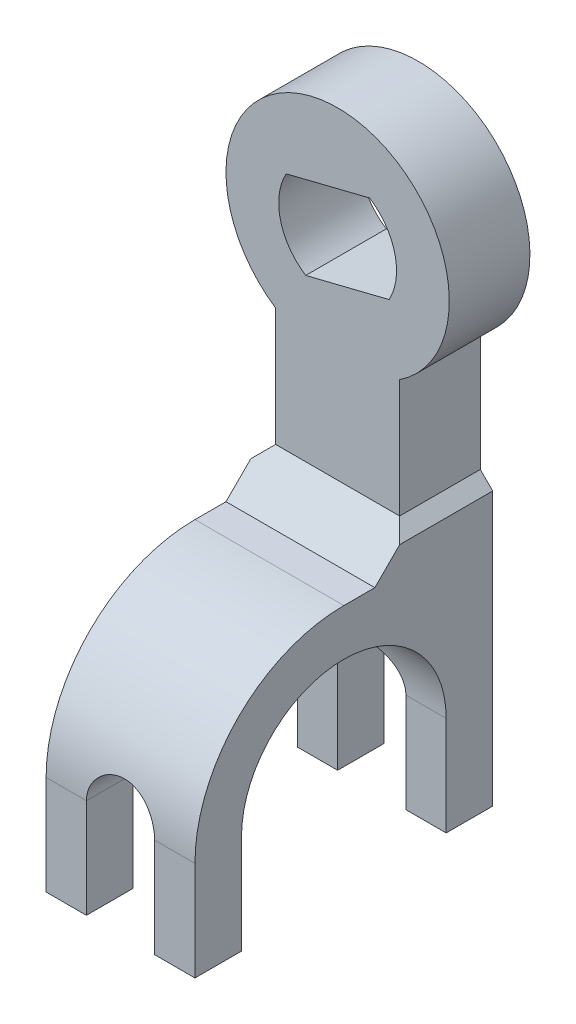
ISO-10303-21;
HEADER;
FILE_DESCRIPTION(('STEP AP214'),'2;1');
FILE_NAME('part.step','',(''),(''),'','','');
FILE_SCHEMA(('AUTOMOTIVE_DESIGN { 1 0 10303 214 1 1 1 1 }'));
ENDSEC;
DATA;
#1=APPLICATION_CONTEXT('core data for automotive mechanical design processes');
#2=APPLICATION_PROTOCOL_DEFINITION('international standard','automotive_design',2000,#1);
#3=PRODUCT_CONTEXT('',#1,'mechanical');
#4=PRODUCT('Part','Part','',(#3));
#5=PRODUCT_RELATED_PRODUCT_CATEGORY('part','',(#4));
#6=PRODUCT_DEFINITION_FORMATION('','',#4);
#7=PRODUCT_DEFINITION_CONTEXT('part definition',#1,'design');
#8=PRODUCT_DEFINITION('design','',#6,#7);
#9=PRODUCT_DEFINITION_SHAPE('','',#8);
#10=(LENGTH_UNIT() NAMED_UNIT(*) SI_UNIT(.MILLI.,.METRE.));
#11=(NAMED_UNIT(*) PLANE_ANGLE_UNIT() SI_UNIT($,.RADIAN.));
#12=(NAMED_UNIT(*) SI_UNIT($,.STERADIAN.) SOLID_ANGLE_UNIT());
#13=UNCERTAINTY_MEASURE_WITH_UNIT(LENGTH_MEASURE(1.E-05),#10,'distance_accuracy_value','');
#14=(GEOMETRIC_REPRESENTATION_CONTEXT(3) GLOBAL_UNCERTAINTY_ASSIGNED_CONTEXT((#13)) GLOBAL_UNIT_ASSIGNED_CONTEXT((#10,
#11,#12)) REPRESENTATION_CONTEXT('',''));
#15=CARTESIAN_POINT('',(0.,0.,0.));
#16=DIRECTION('',(0.,0.,1.));
#17=DIRECTION('',(1.,0.,0.));
#18=AXIS2_PLACEMENT_3D('',#15,#16,#17);
#19=CARTESIAN_POINT('',(6.,-40.,24.));
#20=DIRECTION('',(0.,0.,-1.));
#21=DIRECTION('',(-1.,0.,0.));
#22=AXIS2_PLACEMENT_3D('',#19,#20,#21);
#23=PLANE('',#22);
#24=DIRECTION('',(-1.,0.,0.));
#25=VECTOR('',#24,1.);
#26=CARTESIAN_POINT('',(6.,-32.,24.));
#27=LINE('',#26,#25);
#28=CARTESIAN_POINT('',(6.,-32.,24.));
#29=VERTEX_POINT('',#28);
#30=CARTESIAN_POINT('',(2.75,-32.,24.));
#31=VERTEX_POINT('',#30);
#32=EDGE_CURVE('E432',#29,#31,#27,.T.);
#33=ORIENTED_EDGE('',*,*,#32,.T.);
#34=DIRECTION('',(0.,1.,0.));
#35=VECTOR('',#34,1.);
#36=CARTESIAN_POINT('',(2.75,-32.,24.));
#37=LINE('',#36,#35);
#38=CARTESIAN_POINT('',(2.75,-40.,24.));
#39=VERTEX_POINT('',#38);
#40=EDGE_CURVE('E251',#39,#31,#37,.T.);
#41=ORIENTED_EDGE('',*,*,#40,.F.);
#42=DIRECTION('',(-1.,0.,0.));
#43=VECTOR('',#42,1.);
#44=CARTESIAN_POINT('',(6.,-40.,24.));
#45=LINE('',#44,#43);
#46=CARTESIAN_POINT('',(6.,-40.,24.));
#47=VERTEX_POINT('',#46);
#48=EDGE_CURVE('E420',#47,#39,#45,.T.);
#49=ORIENTED_EDGE('',*,*,#48,.F.);
#50=DIRECTION('',(0.,-1.,0.));
#51=VECTOR('',#50,1.);
#52=CARTESIAN_POINT('',(6.,-40.,24.));
#53=LINE('',#52,#51);
#54=EDGE_CURVE('E679',#29,#47,#53,.T.);
#55=ORIENTED_EDGE('',*,*,#54,.F.);
#56=EDGE_LOOP('',(#33,#41,#49,#55));
#57=FACE_BOUND('',#56,.T.);
#58=ADVANCED_FACE('F41',(#57),#23,.F.);
#59=CARTESIAN_POINT('',(6.,-40.,20.25));
#60=DIRECTION('',(0.,1.,0.));
#61=DIRECTION('',(0.,0.,1.));
#62=AXIS2_PLACEMENT_3D('',#59,#60,#61);
#63=PLANE('',#62);
#64=ORIENTED_EDGE('',*,*,#48,.T.);
#65=DIRECTION('',(0.,0.,1.));
#66=VECTOR('',#65,1.);
#67=CARTESIAN_POINT('',(2.75,-40.,0.));
#68=LINE('',#67,#66);
#69=CARTESIAN_POINT('',(2.75,-40.,20.25));
#70=VERTEX_POINT('',#69);
#71=EDGE_CURVE('E270',#70,#39,#68,.T.);
#72=ORIENTED_EDGE('',*,*,#71,.F.);
#73=DIRECTION('',(-1.,0.,0.));
#74=VECTOR('',#73,1.);
#75=CARTESIAN_POINT('',(6.,-40.,20.25));
#76=LINE('',#75,#74);
#77=CARTESIAN_POINT('',(6.,-40.,20.25));
#78=VERTEX_POINT('',#77);
#79=EDGE_CURVE('E421',#78,#70,#76,.T.);
#80=ORIENTED_EDGE('',*,*,#79,.F.);
#81=DIRECTION('',(0.,0.,-1.));
#82=VECTOR('',#81,1.);
#83=CARTESIAN_POINT('',(6.,-40.,20.25));
#84=LINE('',#83,#82);
#85=EDGE_CURVE('E682',#47,#78,#84,.T.);
#86=ORIENTED_EDGE('',*,*,#85,.F.);
#87=EDGE_LOOP('',(#64,#72,#80,#86));
#88=FACE_BOUND('',#87,.T.);
#89=ADVANCED_FACE('F393',(#88),#63,.F.);
#90=CARTESIAN_POINT('',(6.,-32.,20.25));
#91=DIRECTION('',(0.,0.,1.));
#92=DIRECTION('',(1.,0.,0.));
#93=AXIS2_PLACEMENT_3D('',#90,#91,#92);
#94=PLANE('',#93);
#95=ORIENTED_EDGE('',*,*,#79,.T.);
#96=DIRECTION('',(0.,1.,0.));
#97=VECTOR('',#96,1.);
#98=CARTESIAN_POINT('',(2.75,-32.,20.25));
#99=LINE('',#98,#97);
#100=CARTESIAN_POINT('',(2.75,-32.,20.25));
#101=VERTEX_POINT('',#100);
#102=EDGE_CURVE('E283',#70,#101,#99,.T.);
#103=ORIENTED_EDGE('',*,*,#102,.T.);
#104=DIRECTION('',(-1.,0.,0.));
#105=VECTOR('',#104,1.);
#106=CARTESIAN_POINT('',(6.,-32.,20.25));
#107=LINE('',#106,#105);
#108=CARTESIAN_POINT('',(6.,-32.,20.25));
#109=VERTEX_POINT('',#108);
#110=EDGE_CURVE('E621',#109,#101,#107,.T.);
#111=ORIENTED_EDGE('',*,*,#110,.F.);
#112=DIRECTION('',(0.,1.,0.));
#113=VECTOR('',#112,1.);
#114=CARTESIAN_POINT('',(6.,-32.,20.25));
#115=LINE('',#114,#113);
#116=EDGE_CURVE('E686',#78,#109,#115,.T.);
#117=ORIENTED_EDGE('',*,*,#116,.F.);
#118=EDGE_LOOP('',(#95,#103,#111,#117));
#119=FACE_BOUND('',#118,.T.);
#120=ADVANCED_FACE('F398',(#119),#94,.F.);
#121=CARTESIAN_POINT('',(6.,-32.,3.75));
#122=DIRECTION('',(0.,0.,-1.));
#123=DIRECTION('',(0.,1.,0.));
#124=AXIS2_PLACEMENT_3D('',#121,#122,#123);
#125=PLANE('',#124);
#126=DIRECTION('',(-1.,0.,0.));
#127=VECTOR('',#126,1.);
#128=CARTESIAN_POINT('',(6.,-32.,3.75));
#129=LINE('',#128,#127);
#130=CARTESIAN_POINT('',(6.,-32.,3.75));
#131=VERTEX_POINT('',#130);
#132=CARTESIAN_POINT('',(2.75,-32.,3.75));
#133=VERTEX_POINT('',#132);
#134=EDGE_CURVE('E617',#131,#133,#129,.T.);
#135=ORIENTED_EDGE('',*,*,#134,.T.);
#136=DIRECTION('',(0.,-1.,0.));
#137=VECTOR('',#136,1.);
#138=CARTESIAN_POINT('',(2.75,-32.,3.75));
#139=LINE('',#138,#137);
#140=CARTESIAN_POINT('',(2.75,-40.,3.75));
#141=VERTEX_POINT('',#140);
#142=EDGE_CURVE('E279',#133,#141,#139,.T.);
#143=ORIENTED_EDGE('',*,*,#142,.T.);
#144=DIRECTION('',(-1.,0.,0.));
#145=VECTOR('',#144,1.);
#146=CARTESIAN_POINT('',(6.,-40.,3.75));
#147=LINE('',#146,#145);
#148=CARTESIAN_POINT('',(6.,-40.,3.75));
#149=VERTEX_POINT('',#148);
#150=EDGE_CURVE('E612',#149,#141,#147,.T.);
#151=ORIENTED_EDGE('',*,*,#150,.F.);
#152=DIRECTION('',(0.,-1.,0.));
#153=VECTOR('',#152,1.);
#154=CARTESIAN_POINT('',(6.,-32.,3.75));
#155=LINE('',#154,#153);
#156=EDGE_CURVE('E663',#131,#149,#155,.T.);
#157=ORIENTED_EDGE('',*,*,#156,.F.);
#158=EDGE_LOOP('',(#135,#143,#151,#157));
#159=FACE_BOUND('',#158,.T.);
#160=ADVANCED_FACE('F650',(#159),#125,.F.);
#161=CARTESIAN_POINT('',(6.,-40.,0.));
#162=DIRECTION('',(0.,1.,0.));
#163=DIRECTION('',(0.,0.,1.));
#164=AXIS2_PLACEMENT_3D('',#161,#162,#163);
#165=PLANE('',#164);
#166=ORIENTED_EDGE('',*,*,#150,.T.);
#167=CARTESIAN_POINT('',(2.75,-40.,0.));
#168=VERTEX_POINT('',#167);
#169=EDGE_CURVE('E267',#168,#141,#68,.T.);
#170=ORIENTED_EDGE('',*,*,#169,.F.);
#171=DIRECTION('',(-1.,0.,0.));
#172=VECTOR('',#171,1.);
#173=CARTESIAN_POINT('',(6.,-40.,0.));
#174=LINE('',#173,#172);
#175=CARTESIAN_POINT('',(6.,-40.,0.));
#176=VERTEX_POINT('',#175);
#177=EDGE_CURVE('E608',#176,#168,#174,.T.);
#178=ORIENTED_EDGE('',*,*,#177,.F.);
#179=DIRECTION('',(0.,0.,-1.));
#180=VECTOR('',#179,1.);
#181=CARTESIAN_POINT('',(6.,-40.,0.));
#182=LINE('',#181,#180);
#183=EDGE_CURVE('E576',#149,#176,#182,.T.);
#184=ORIENTED_EDGE('',*,*,#183,.F.);
#185=EDGE_LOOP('',(#166,#170,#178,#184));
#186=FACE_BOUND('',#185,.T.);
#187=ADVANCED_FACE('F361',(#186),#165,.F.);
#188=CARTESIAN_POINT('',(0.,0.,6.5));
#189=DIRECTION('',(0.,0.,1.));
#190=DIRECTION('',(1.,0.,0.));
#191=AXIS2_PLACEMENT_3D('',#188,#189,#190);
#192=PLANE('',#191);
#193=DIRECTION('',(-0.970295726275996,-0.241921895599669,0.));
#194=VECTOR('',#193,1.);
#195=CARTESIAN_POINT('',(2.57495683185502,3.99150313968099,6.5));
#196=LINE('',#195,#194);
#197=CARTESIAN_POINT('',(2.57495683185502,3.99150313968099,6.5));
#198=VERTEX_POINT('',#197);
#199=CARTESIAN_POINT('',(-4.14744915325286,2.31541908111299,6.5));
#200=VERTEX_POINT('',#199);
#201=EDGE_CURVE('E439',#198,#200,#196,.T.);
#202=ORIENTED_EDGE('',*,*,#201,.F.);
#203=CARTESIAN_POINT('',(0.,0.,6.5));
#204=DIRECTION('',(0.,0.,1.));
#205=DIRECTION('',(1.,0.,0.));
#206=AXIS2_PLACEMENT_3D('',#203,#204,#205);
#207=CIRCLE('',#206,4.75);
#208=CARTESIAN_POINT('',(4.14744915325286,-2.31541908111299,6.5));
#209=VERTEX_POINT('',#208);
#210=EDGE_CURVE('E436',#209,#198,#207,.T.);
#211=ORIENTED_EDGE('',*,*,#210,.F.);
#212=DIRECTION('',(0.970295726275996,0.241921895599669,0.));
#213=VECTOR('',#212,1.);
#214=CARTESIAN_POINT('',(4.14744915325286,-2.31541908111299,6.5));
#215=LINE('',#214,#213);
#216=CARTESIAN_POINT('',(-2.57495683185502,-3.99150313968099,6.5));
#217=VERTEX_POINT('',#216);
#218=EDGE_CURVE('E447',#217,#209,#215,.T.);
#219=ORIENTED_EDGE('',*,*,#218,.F.);
#220=CARTESIAN_POINT('',(0.,0.,6.5));
#221=DIRECTION('',(0.,0.,1.));
#222=DIRECTION('',(1.,0.,0.));
#223=AXIS2_PLACEMENT_3D('',#220,#221,#222);
#224=CIRCLE('',#223,4.75);
#225=EDGE_CURVE('E443',#200,#217,#224,.T.);
#226=ORIENTED_EDGE('',*,*,#225,.F.);
#227=EDGE_LOOP('',(#202,#211,#219,#226));
#228=FACE_BOUND('',#227,.T.);
#229=DIRECTION('',(0.,-1.,0.));
#230=VECTOR('',#229,1.);
#231=CARTESIAN_POINT('',(-5.,-7.48331477354788,6.5));
#232=LINE('',#231,#230);
#233=CARTESIAN_POINT('',(-5.,-7.48331477354788,6.5));
#234=VERTEX_POINT('',#233);
#235=CARTESIAN_POINT('',(-5.,-17.,6.5));
#236=VERTEX_POINT('',#235);
#237=EDGE_CURVE('E483',#234,#236,#232,.T.);
#238=ORIENTED_EDGE('',*,*,#237,.T.);
#239=DIRECTION('',(1.,0.,0.));
#240=VECTOR('',#239,1.);
#241=CARTESIAN_POINT('',(0.,-17.,6.5));
#242=LINE('',#241,#240);
#243=CARTESIAN_POINT('',(5.,-17.,6.5));
#244=VERTEX_POINT('',#243);
#245=EDGE_CURVE('E512',#236,#244,#242,.T.);
#246=ORIENTED_EDGE('',*,*,#245,.T.);
#247=DIRECTION('',(0.,1.,0.));
#248=VECTOR('',#247,1.);
#249=CARTESIAN_POINT('',(5.,-7.48331477354788,6.5));
#250=LINE('',#249,#248);
#251=CARTESIAN_POINT('',(5.,-7.48331477354788,6.5));
#252=VERTEX_POINT('',#251);
#253=EDGE_CURVE('E488',#244,#252,#250,.T.);
#254=ORIENTED_EDGE('',*,*,#253,.T.);
#255=CARTESIAN_POINT('',(0.,0.,6.5));
#256=DIRECTION('',(0.,0.,1.));
#257=DIRECTION('',(1.,0.,0.));
#258=AXIS2_PLACEMENT_3D('',#255,#256,#257);
#259=CIRCLE('',#258,9.);
#260=EDGE_CURVE('E479',#252,#234,#259,.T.);
#261=ORIENTED_EDGE('',*,*,#260,.T.);
#262=EDGE_LOOP('',(#238,#246,#254,#261));
#263=FACE_BOUND('',#262,.T.);
#264=ADVANCED_FACE('F357',(#228,#263),#192,.T.);
#265=CARTESIAN_POINT('',(-5.,-7.48331477354788,6.5));
#266=DIRECTION('',(1.,0.,0.));
#267=DIRECTION('',(0.,1.,0.));
#268=AXIS2_PLACEMENT_3D('',#265,#266,#267);
#269=PLANE('',#268);
#270=DIRECTION('',(0.,-1.,0.));
#271=VECTOR('',#270,1.);
#272=CARTESIAN_POINT('',(-5.,-7.48331477354788,0.));
#273=LINE('',#272,#271);
#274=CARTESIAN_POINT('',(-5.,-7.48331477354788,0.));
#275=VERTEX_POINT('',#274);
#276=CARTESIAN_POINT('',(-5.,-17.,0.));
#277=VERTEX_POINT('',#276);
#278=EDGE_CURVE('E495',#275,#277,#273,.T.);
#279=ORIENTED_EDGE('',*,*,#278,.T.);
#280=DIRECTION('',(0.,0.,1.));
#281=VECTOR('',#280,1.);
#282=CARTESIAN_POINT('',(-5.,-17.,6.5));
#283=LINE('',#282,#281);
#284=EDGE_CURVE('E508',#277,#236,#283,.T.);
#285=ORIENTED_EDGE('',*,*,#284,.T.);
#286=ORIENTED_EDGE('',*,*,#237,.F.);
#287=DIRECTION('',(0.,0.,-1.));
#288=VECTOR('',#287,1.);
#289=CARTESIAN_POINT('',(-5.,-7.48331477354788,6.5));
#290=LINE('',#289,#288);
#291=EDGE_CURVE('E504',#234,#275,#290,.T.);
#292=ORIENTED_EDGE('',*,*,#291,.T.);
#293=EDGE_LOOP('',(#279,#285,#286,#292));
#294=FACE_BOUND('',#293,.T.);
#295=ADVANCED_FACE('F360',(#294),#269,.F.);
#296=CARTESIAN_POINT('',(5.,-7.48331477354788,6.5));
#297=DIRECTION('',(-1.,0.,0.));
#298=DIRECTION('',(0.,-1.,0.));
#299=AXIS2_PLACEMENT_3D('',#296,#297,#298);
#300=PLANE('',#299);
#301=ORIENTED_EDGE('',*,*,#253,.F.);
#302=DIRECTION('',(0.,0.,-1.));
#303=VECTOR('',#302,1.);
#304=CARTESIAN_POINT('',(5.,-17.,0.));
#305=LINE('',#304,#303);
#306=CARTESIAN_POINT('',(5.,-17.,0.));
#307=VERTEX_POINT('',#306);
#308=EDGE_CURVE('E518',#244,#307,#305,.T.);
#309=ORIENTED_EDGE('',*,*,#308,.T.);
#310=DIRECTION('',(0.,1.,0.));
#311=VECTOR('',#310,1.);
#312=CARTESIAN_POINT('',(5.,-7.48331477354788,0.));
#313=LINE('',#312,#311);
#314=CARTESIAN_POINT('',(5.,-7.48331477354788,0.));
#315=VERTEX_POINT('',#314);
#316=EDGE_CURVE('E484',#307,#315,#313,.T.);
#317=ORIENTED_EDGE('',*,*,#316,.T.);
#318=DIRECTION('',(0.,0.,-1.));
#319=VECTOR('',#318,1.);
#320=CARTESIAN_POINT('',(5.,-7.48331477354788,6.5));
#321=LINE('',#320,#319);
#322=EDGE_CURVE('E491',#252,#315,#321,.T.);
#323=ORIENTED_EDGE('',*,*,#322,.F.);
#324=EDGE_LOOP('',(#301,#309,#317,#323));
#325=FACE_BOUND('',#324,.T.);
#326=ADVANCED_FACE('F365',(#325),#300,.F.);
#327=CARTESIAN_POINT('',(0.,0.,0.));
#328=DIRECTION('',(0.,0.,1.));
#329=DIRECTION('',(1.,0.,0.));
#330=AXIS2_PLACEMENT_3D('',#327,#328,#329);
#331=PLANE('',#330);
#332=ORIENTED_EDGE('',*,*,#177,.T.);
#333=DIRECTION('',(0.,1.,0.));
#334=VECTOR('',#333,1.);
#335=CARTESIAN_POINT('',(2.75,-32.,0.));
#336=LINE('',#335,#334);
#337=CARTESIAN_POINT('',(2.75,-32.,0.));
#338=VERTEX_POINT('',#337);
#339=EDGE_CURVE('E245',#168,#338,#336,.T.);
#340=ORIENTED_EDGE('',*,*,#339,.T.);
#341=CARTESIAN_POINT('',(0.,-32.,0.));
#342=DIRECTION('',(0.,0.,1.));
#343=DIRECTION('',(1.,0.,0.));
#344=AXIS2_PLACEMENT_3D('',#341,#342,#343);
#345=CIRCLE('',#344,2.75);
#346=CARTESIAN_POINT('',(-2.75,-32.,0.));
#347=VERTEX_POINT('',#346);
#348=EDGE_CURVE('E228',#338,#347,#345,.T.);
#349=ORIENTED_EDGE('',*,*,#348,.T.);
#350=DIRECTION('',(0.,-1.,0.));
#351=VECTOR('',#350,1.);
#352=CARTESIAN_POINT('',(-2.75,-32.,0.));
#353=LINE('',#352,#351);
#354=CARTESIAN_POINT('',(-2.75,-40.,0.));
#355=VERTEX_POINT('',#354);
#356=EDGE_CURVE('E239',#347,#355,#353,.T.);
#357=ORIENTED_EDGE('',*,*,#356,.T.);
#358=CARTESIAN_POINT('',(-6.,-40.,0.));
#359=VERTEX_POINT('',#358);
#360=EDGE_CURVE('E574',#355,#359,#174,.T.);
#361=ORIENTED_EDGE('',*,*,#360,.T.);
#362=DIRECTION('',(0.,1.,0.));
#363=VECTOR('',#362,1.);
#364=CARTESIAN_POINT('',(-6.,-20.,0.));
#365=LINE('',#364,#363);
#366=CARTESIAN_POINT('',(-6.,-18.,0.));
#367=VERTEX_POINT('',#366);
#368=EDGE_CURVE('E67',#359,#367,#365,.T.);
#369=ORIENTED_EDGE('',*,*,#368,.T.);
#370=DIRECTION('',(-0.707106781186551,-0.707106781186544,0.));
#371=VECTOR('',#370,1.);
#372=CARTESIAN_POINT('',(6.00000000000001,-6.00000000000007,0.));
#373=LINE('',#372,#371);
#374=EDGE_CURVE('E524',#367,#277,#373,.F.);
#375=ORIENTED_EDGE('',*,*,#374,.T.);
#376=ORIENTED_EDGE('',*,*,#278,.F.);
#377=CARTESIAN_POINT('',(0.,0.,0.));
#378=DIRECTION('',(0.,0.,1.));
#379=DIRECTION('',(1.,0.,0.));
#380=AXIS2_PLACEMENT_3D('',#377,#378,#379);
#381=CIRCLE('',#380,9.);
#382=EDGE_CURVE('E478',#315,#275,#381,.T.);
#383=ORIENTED_EDGE('',*,*,#382,.F.);
#384=ORIENTED_EDGE('',*,*,#316,.F.);
#385=DIRECTION('',(-0.707106781186551,0.707106781186544,0.));
#386=VECTOR('',#385,1.);
#387=CARTESIAN_POINT('',(-6.00000000000001,-6.00000000000007,0.));
#388=LINE('',#387,#386);
#389=CARTESIAN_POINT('',(6.,-18.,0.));
#390=VERTEX_POINT('',#389);
#391=EDGE_CURVE('E11',#307,#390,#388,.F.);
#392=ORIENTED_EDGE('',*,*,#391,.T.);
#393=DIRECTION('',(0.,1.,0.));
#394=VECTOR('',#393,1.);
#395=CARTESIAN_POINT('',(6.,-20.,0.));
#396=LINE('',#395,#394);
#397=EDGE_CURVE('E60',#176,#390,#396,.T.);
#398=ORIENTED_EDGE('',*,*,#397,.F.);
#399=EDGE_LOOP('',(#332,#340,#349,#357,#361,#369,#375,#376,#383,#384,#392,#398));
#400=FACE_BOUND('',#399,.T.);
#401=CARTESIAN_POINT('',(0.,0.,0.));
#402=DIRECTION('',(0.,0.,1.));
#403=DIRECTION('',(1.,0.,0.));
#404=AXIS2_PLACEMENT_3D('',#401,#402,#403);
#405=CIRCLE('',#404,4.75);
#406=CARTESIAN_POINT('',(4.14744915325286,-2.31541908111299,0.));
#407=VERTEX_POINT('',#406);
#408=CARTESIAN_POINT('',(2.57495683185502,3.99150313968099,0.));
#409=VERTEX_POINT('',#408);
#410=EDGE_CURVE('E435',#407,#409,#405,.T.);
#411=ORIENTED_EDGE('',*,*,#410,.T.);
#412=DIRECTION('',(-0.970295726275996,-0.241921895599669,0.));
#413=VECTOR('',#412,1.);
#414=CARTESIAN_POINT('',(2.57495683185502,3.99150313968099,0.));
#415=LINE('',#414,#413);
#416=CARTESIAN_POINT('',(-4.14744915325286,2.31541908111299,0.));
#417=VERTEX_POINT('',#416);
#418=EDGE_CURVE('E454',#409,#417,#415,.T.);
#419=ORIENTED_EDGE('',*,*,#418,.T.);
#420=CARTESIAN_POINT('',(0.,0.,0.));
#421=DIRECTION('',(0.,0.,1.));
#422=DIRECTION('',(1.,0.,0.));
#423=AXIS2_PLACEMENT_3D('',#420,#421,#422);
#424=CIRCLE('',#423,4.75);
#425=CARTESIAN_POINT('',(-2.57495683185502,-3.99150313968099,0.));
#426=VERTEX_POINT('',#425);
#427=EDGE_CURVE('E458',#417,#426,#424,.T.);
#428=ORIENTED_EDGE('',*,*,#427,.T.);
#429=DIRECTION('',(0.970295726275996,0.241921895599669,0.));
#430=VECTOR('',#429,1.);
#431=CARTESIAN_POINT('',(4.14744915325286,-2.31541908111299,0.));
#432=LINE('',#431,#430);
#433=EDGE_CURVE('E440',#426,#407,#432,.T.);
#434=ORIENTED_EDGE('',*,*,#433,.T.);
#435=EDGE_LOOP('',(#411,#419,#428,#434));
#436=FACE_BOUND('',#435,.T.);
#437=ADVANCED_FACE('F248',(#400,#436),#331,.F.);
#438=CARTESIAN_POINT('',(0.,0.,6.5));
#439=DIRECTION('',(0.,0.,-1.));
#440=DIRECTION('',(-1.,0.,0.));
#441=AXIS2_PLACEMENT_3D('',#438,#439,#440);
#442=CYLINDRICAL_SURFACE('',#441,9.);
#443=ORIENTED_EDGE('',*,*,#382,.T.);
#444=ORIENTED_EDGE('',*,*,#291,.F.);
#445=ORIENTED_EDGE('',*,*,#260,.F.);
#446=ORIENTED_EDGE('',*,*,#322,.T.);
#447=EDGE_LOOP('',(#443,#444,#445,#446));
#448=FACE_BOUND('',#447,.T.);
#449=ADVANCED_FACE('F355',(#448),#442,.T.);
#450=CARTESIAN_POINT('',(0.,0.,6.5));
#451=DIRECTION('',(0.,0.,-1.));
#452=DIRECTION('',(-1.,0.,0.));
#453=AXIS2_PLACEMENT_3D('',#450,#451,#452);
#454=CYLINDRICAL_SURFACE('',#453,4.75);
#455=ORIENTED_EDGE('',*,*,#410,.F.);
#456=DIRECTION('',(0.,0.,-1.));
#457=VECTOR('',#456,1.);
#458=CARTESIAN_POINT('',(4.14744915325286,-2.31541908111299,6.5));
#459=LINE('',#458,#457);
#460=EDGE_CURVE('E450',#209,#407,#459,.T.);
#461=ORIENTED_EDGE('',*,*,#460,.F.);
#462=ORIENTED_EDGE('',*,*,#210,.T.);
#463=DIRECTION('',(0.,0.,-1.));
#464=VECTOR('',#463,1.);
#465=CARTESIAN_POINT('',(2.57495683185502,3.99150313968099,6.5));
#466=LINE('',#465,#464);
#467=EDGE_CURVE('E474',#198,#409,#466,.T.);
#468=ORIENTED_EDGE('',*,*,#467,.T.);
#469=EDGE_LOOP('',(#455,#461,#462,#468));
#470=FACE_BOUND('',#469,.T.);
#471=ADVANCED_FACE('F351',(#470),#454,.F.);
#472=CARTESIAN_POINT('',(2.57495683185502,3.99150313968099,6.5));
#473=DIRECTION('',(0.241921895599669,-0.970295726275996,0.));
#474=DIRECTION('',(0.970295726275996,0.241921895599669,0.));
#475=AXIS2_PLACEMENT_3D('',#472,#473,#474);
#476=PLANE('',#475);
#477=ORIENTED_EDGE('',*,*,#418,.F.);
#478=ORIENTED_EDGE('',*,*,#467,.F.);
#479=ORIENTED_EDGE('',*,*,#201,.T.);
#480=DIRECTION('',(0.,0.,-1.));
#481=VECTOR('',#480,1.);
#482=CARTESIAN_POINT('',(-4.14744915325286,2.31541908111299,6.5));
#483=LINE('',#482,#481);
#484=EDGE_CURVE('E471',#200,#417,#483,.T.);
#485=ORIENTED_EDGE('',*,*,#484,.T.);
#486=EDGE_LOOP('',(#477,#478,#479,#485));
#487=FACE_BOUND('',#486,.T.);
#488=ADVANCED_FACE('F347',(#487),#476,.T.);
#489=CARTESIAN_POINT('',(0.,0.,6.5));
#490=DIRECTION('',(0.,0.,-1.));
#491=DIRECTION('',(-1.,0.,0.));
#492=AXIS2_PLACEMENT_3D('',#489,#490,#491);
#493=CYLINDRICAL_SURFACE('',#492,4.75);
#494=ORIENTED_EDGE('',*,*,#427,.F.);
#495=ORIENTED_EDGE('',*,*,#484,.F.);
#496=ORIENTED_EDGE('',*,*,#225,.T.);
#497=DIRECTION('',(0.,0.,-1.));
#498=VECTOR('',#497,1.);
#499=CARTESIAN_POINT('',(-2.57495683185502,-3.99150313968099,6.5));
#500=LINE('',#499,#498);
#501=EDGE_CURVE('E468',#217,#426,#500,.T.);
#502=ORIENTED_EDGE('',*,*,#501,.T.);
#503=EDGE_LOOP('',(#494,#495,#496,#502));
#504=FACE_BOUND('',#503,.T.);
#505=ADVANCED_FACE('F343',(#504),#493,.F.);
#506=CARTESIAN_POINT('',(4.14744915325286,-2.31541908111299,6.5));
#507=DIRECTION('',(-0.241921895599669,0.970295726275996,0.));
#508=DIRECTION('',(-0.970295726275996,-0.241921895599669,0.));
#509=AXIS2_PLACEMENT_3D('',#506,#507,#508);
#510=PLANE('',#509);
#511=ORIENTED_EDGE('',*,*,#433,.F.);
#512=ORIENTED_EDGE('',*,*,#501,.F.);
#513=ORIENTED_EDGE('',*,*,#218,.T.);
#514=ORIENTED_EDGE('',*,*,#460,.T.);
#515=EDGE_LOOP('',(#511,#512,#513,#514));
#516=FACE_BOUND('',#515,.T.);
#517=ADVANCED_FACE('F340',(#516),#510,.T.);
#518=CARTESIAN_POINT('',(6.,-20.,12.));
#519=DIRECTION('',(0.,-1.,0.));
#520=DIRECTION('',(0.,0.,-1.));
#521=AXIS2_PLACEMENT_3D('',#518,#519,#520);
#522=PLANE('',#521);
#523=DIRECTION('',(0.,0.,1.));
#524=VECTOR('',#523,1.);
#525=CARTESIAN_POINT('',(6.,-20.,12.));
#526=LINE('',#525,#524);
#527=CARTESIAN_POINT('',(6.,-20.,9.50000000000005));
#528=VERTEX_POINT('',#527);
#529=CARTESIAN_POINT('',(6.,-20.,12.));
#530=VERTEX_POINT('',#529);
#531=EDGE_CURVE('E566',#528,#530,#526,.T.);
#532=ORIENTED_EDGE('',*,*,#531,.F.);
#533=DIRECTION('',(-1.,0.,0.));
#534=VECTOR('',#533,1.);
#535=CARTESIAN_POINT('',(6.,-20.,9.50000000000005));
#536=LINE('',#535,#534);
#537=CARTESIAN_POINT('',(-6.,-20.,9.50000000000005));
#538=VERTEX_POINT('',#537);
#539=EDGE_CURVE('E515',#528,#538,#536,.T.);
#540=ORIENTED_EDGE('',*,*,#539,.T.);
#541=DIRECTION('',(0.,0.,1.));
#542=VECTOR('',#541,1.);
#543=CARTESIAN_POINT('',(-6.,-20.,12.));
#544=LINE('',#543,#542);
#545=CARTESIAN_POINT('',(-6.,-20.,12.));
#546=VERTEX_POINT('',#545);
#547=EDGE_CURVE('E561',#538,#546,#544,.T.);
#548=ORIENTED_EDGE('',*,*,#547,.T.);
#549=DIRECTION('',(-1.,0.,0.));
#550=VECTOR('',#549,1.);
#551=CARTESIAN_POINT('',(6.,-20.,12.));
#552=LINE('',#551,#550);
#553=EDGE_CURVE('E567',#530,#546,#552,.T.);
#554=ORIENTED_EDGE('',*,*,#553,.F.);
#555=EDGE_LOOP('',(#532,#540,#548,#554));
#556=FACE_BOUND('',#555,.T.);
#557=ADVANCED_FACE('F337',(#556),#522,.F.);
#558=CARTESIAN_POINT('',(6.,-32.,12.));
#559=DIRECTION('',(-1.,0.,0.));
#560=DIRECTION('',(0.,0.,1.));
#561=AXIS2_PLACEMENT_3D('',#558,#559,#560);
#562=CYLINDRICAL_SURFACE('',#561,12.);
#563=CARTESIAN_POINT('',(-2.75,-32.,24.));
#564=VERTEX_POINT('',#563);
#565=CARTESIAN_POINT('',(-6.,-32.,24.));
#566=VERTEX_POINT('',#565);
#567=EDGE_CURVE('E426',#564,#566,#27,.T.);
#568=ORIENTED_EDGE('',*,*,#567,.F.);
#569=CARTESIAN_POINT('',(-2.75,-32.,24.));
#570=CARTESIAN_POINT('',(-2.75000852448172,-31.9237133983063,24.0000069443836));
#571=CARTESIAN_POINT('',(-2.74682575786348,-31.8474315881217,23.9992726985721));
#572=CARTESIAN_POINT('',(-2.73414375512468,-31.6954325446232,23.9963732983839));
#573=CARTESIAN_POINT('',(-2.72464539902771,-31.6197152341375,23.9942083433645));
#574=CARTESIAN_POINT('',(-2.69942000851805,-31.4695079151587,23.9885038800031));
#575=CARTESIAN_POINT('',(-2.68370371556819,-31.3950160197027,23.9849667423056));
#576=CARTESIAN_POINT('',(-2.64618483862786,-31.2476748777089,23.9766215189166));
#577=CARTESIAN_POINT('',(-2.62438221084139,-31.1748256429953,23.9718134240796));
#578=CARTESIAN_POINT('',(-2.55007100416328,-30.9595001238249,23.9556674917084));
#579=CARTESIAN_POINT('',(-2.48863702040612,-30.8201156379737,23.9426027216054));
#580=CARTESIAN_POINT('',(-2.3438660204311,-30.5536866591188,23.9132788519181));
#581=CARTESIAN_POINT('',(-2.26052527861563,-30.4266442701259,23.8970192091129));
#582=CARTESIAN_POINT('',(-2.07275550445702,-30.1862208459384,23.8627644786651));
#583=CARTESIAN_POINT('',(-1.9680182419284,-30.073083401407,23.8447463059488));
#584=CARTESIAN_POINT('',(-1.74108526999735,-29.8658143909164,23.8091634949926));
#585=CARTESIAN_POINT('',(-1.61888648232609,-29.7716861831457,23.7915989373658));
#586=CARTESIAN_POINT('',(-1.3586581375156,-29.6040050687438,23.7586828074449));
#587=CARTESIAN_POINT('',(-1.22045321741285,-29.53071793102,23.7433609333744));
#588=CARTESIAN_POINT('',(-0.933286880376356,-29.4085110215794,23.717001306964));
#589=CARTESIAN_POINT('',(-0.784327461905886,-29.3595867358921,23.7059627610891));
#590=CARTESIAN_POINT('',(-0.482551292630312,-29.2883085094384,23.6896559449227));
#591=CARTESIAN_POINT('',(-0.329843059397737,-29.2655173088818,23.6842928344081));
#592=CARTESIAN_POINT('',(-0.0226800493854332,-29.2457918217799,23.6796595824892));
#593=CARTESIAN_POINT('',(0.131774528936122,-29.2488546260496,23.6803887555592));
#594=CARTESIAN_POINT('',(0.434755873136062,-29.2804002129281,23.6877722349479));
#595=CARTESIAN_POINT('',(0.583339380775937,-29.3083702713027,23.6943070243861));
#596=CARTESIAN_POINT('',(0.873645982146049,-29.3881220542723,23.7123759184319));
#597=CARTESIAN_POINT('',(1.01536871344028,-29.4399050353249,23.7239102868339));
#598=CARTESIAN_POINT('',(1.2893540248053,-29.5662732965021,23.7507940793882));
#599=CARTESIAN_POINT('',(1.42152387570355,-29.6410524839649,23.7661757301913));
#600=CARTESIAN_POINT('',(1.67162358867767,-29.8111525816653,23.7990011468982));
#601=CARTESIAN_POINT('',(1.78955171758417,-29.9064759881421,23.8164451632747));
#602=CARTESIAN_POINT('',(2.01075922391346,-30.1176405262144,23.8519378758296));
#603=CARTESIAN_POINT('',(2.11362518170224,-30.2339143897807,23.8699911047328));
#604=CARTESIAN_POINT('',(2.29849411508534,-30.4823067947736,23.9042974582486));
#605=CARTESIAN_POINT('',(2.3804916224179,-30.6144294758264,23.9205501104185));
#606=CARTESIAN_POINT('',(2.52141782597508,-30.8913203239861,23.9494879310195));
#607=CARTESIAN_POINT('',(2.58027534384927,-31.0361258587306,23.9621620587704));
#608=CARTESIAN_POINT('',(2.67262732717788,-31.333839257219,23.9824195120896));
#609=CARTESIAN_POINT('',(2.70615905531038,-31.4867348616801,23.9900103150502));
#610=CARTESIAN_POINT('',(2.73433280076677,-31.7007573653414,23.9964177854053));
#611=CARTESIAN_POINT('',(2.74020958556098,-31.7604985299803,23.9977595465511));
#612=CARTESIAN_POINT('',(2.74803849223801,-31.8801505596251,23.9995500310683));
#613=CARTESIAN_POINT('',(2.74999715604815,-31.9400609742286,24.0000002430106));
#614=CARTESIAN_POINT('',(2.75000000000001,-32.,24.));
#615=B_SPLINE_CURVE_WITH_KNOTS('',3,(#569,#570,#571,#572,#573,#574,#575,#576,#577,#578,#579,
#580,#581,#582,#583,#584,#585,#586,#587,#588,#589,#590,#591,#592,#593,#594,#595,#596,#597,#598,
#599,#600,#601,#602,#603,#604,#605,#606,#607,#608,#609,#610,#611,#612,#613,#614),.UNSPECIFIED.,
.F.,.F.,(4,2,2,2,2,2,2,2,2,2,2,2,2,2,2,2,2,2,2,2,2,2,4),(0.,0.228781573823797,0.457531275562774,
0.685887526492187,0.914245420667822,1.37056915916475,1.82697055314098,2.29048032255864,
2.75407190453022,3.22333430468783,3.69250972711961,4.15371476102415,4.61486789918182,
5.06674201509909,5.5186399762958,5.97445803583195,6.43033151110341,6.89700930426352,
7.36380925766545,7.83203405398829,8.29956858626747,8.47959585342462,8.65932228464569),.UNSPECIFIED.);
#616=EDGE_CURVE('E319',#564,#31,#615,.T.);
#617=ORIENTED_EDGE('',*,*,#616,.T.);
#618=ORIENTED_EDGE('',*,*,#32,.F.);
#619=CARTESIAN_POINT('',(6.,-32.,12.));
#620=DIRECTION('',(1.,0.,0.));
#621=DIRECTION('',(0.,0.,-1.));
#622=AXIS2_PLACEMENT_3D('',#619,#620,#621);
#623=CIRCLE('',#622,12.);
#624=EDGE_CURVE('E329',#530,#29,#623,.T.);
#625=ORIENTED_EDGE('',*,*,#624,.F.);
#626=ORIENTED_EDGE('',*,*,#553,.T.);
#627=CARTESIAN_POINT('',(-6.,-32.,12.));
#628=DIRECTION('',(1.,0.,0.));
#629=DIRECTION('',(0.,0.,-1.));
#630=AXIS2_PLACEMENT_3D('',#627,#628,#629);
#631=CIRCLE('',#630,12.);
#632=EDGE_CURVE('E328',#546,#566,#631,.T.);
#633=ORIENTED_EDGE('',*,*,#632,.T.);
#634=EDGE_LOOP('',(#568,#617,#618,#625,#626,#633));
#635=FACE_BOUND('',#634,.T.);
#636=ADVANCED_FACE('F331',(#635),#562,.T.);
#637=CARTESIAN_POINT('',(-2.75,-40.,24.));
#638=VERTEX_POINT('',#637);
#639=CARTESIAN_POINT('',(-6.,-40.,24.));
#640=VERTEX_POINT('',#639);
#641=EDGE_CURVE('E412',#638,#640,#45,.T.);
#642=ORIENTED_EDGE('',*,*,#641,.F.);
#643=DIRECTION('',(0.,-1.,0.));
#644=VECTOR('',#643,1.);
#645=CARTESIAN_POINT('',(-2.75,-32.,24.));
#646=LINE('',#645,#644);
#647=EDGE_CURVE('E255',#564,#638,#646,.T.);
#648=ORIENTED_EDGE('',*,*,#647,.F.);
#649=ORIENTED_EDGE('',*,*,#567,.T.);
#650=DIRECTION('',(0.,-1.,0.));
#651=VECTOR('',#650,1.);
#652=CARTESIAN_POINT('',(-6.,-40.,24.));
#653=LINE('',#652,#651);
#654=EDGE_CURVE('E415',#566,#640,#653,.T.);
#655=ORIENTED_EDGE('',*,*,#654,.T.);
#656=EDGE_LOOP('',(#642,#648,#649,#655));
#657=FACE_BOUND('',#656,.T.);
#658=ADVANCED_FACE('F336',(#657),#23,.F.);
#659=CARTESIAN_POINT('',(-2.75,-40.,20.25));
#660=VERTEX_POINT('',#659);
#661=CARTESIAN_POINT('',(-6.,-40.,20.25));
#662=VERTEX_POINT('',#661);
#663=EDGE_CURVE('E428',#660,#662,#76,.T.);
#664=ORIENTED_EDGE('',*,*,#663,.F.);
#665=DIRECTION('',(0.,0.,1.));
#666=VECTOR('',#665,1.);
#667=CARTESIAN_POINT('',(-2.75,-40.,0.));
#668=LINE('',#667,#666);
#669=EDGE_CURVE('E235',#660,#638,#668,.T.);
#670=ORIENTED_EDGE('',*,*,#669,.T.);
#671=ORIENTED_EDGE('',*,*,#641,.T.);
#672=DIRECTION('',(0.,0.,-1.));
#673=VECTOR('',#672,1.);
#674=CARTESIAN_POINT('',(-6.,-40.,20.25));
#675=LINE('',#674,#673);
#676=EDGE_CURVE('E585',#640,#662,#675,.T.);
#677=ORIENTED_EDGE('',*,*,#676,.T.);
#678=EDGE_LOOP('',(#664,#670,#671,#677));
#679=FACE_BOUND('',#678,.T.);
#680=ADVANCED_FACE('F400',(#679),#63,.F.);
#681=CARTESIAN_POINT('',(-2.75,-32.,20.25));
#682=VERTEX_POINT('',#681);
#683=CARTESIAN_POINT('',(-6.,-32.,20.25));
#684=VERTEX_POINT('',#683);
#685=EDGE_CURVE('E620',#682,#684,#107,.T.);
#686=ORIENTED_EDGE('',*,*,#685,.F.);
#687=DIRECTION('',(0.,-1.,0.));
#688=VECTOR('',#687,1.);
#689=CARTESIAN_POINT('',(-2.75,-32.,20.25));
#690=LINE('',#689,#688);
#691=EDGE_CURVE('E275',#682,#660,#690,.T.);
#692=ORIENTED_EDGE('',*,*,#691,.T.);
#693=ORIENTED_EDGE('',*,*,#663,.T.);
#694=DIRECTION('',(0.,1.,0.));
#695=VECTOR('',#694,1.);
#696=CARTESIAN_POINT('',(-6.,-32.,20.25));
#697=LINE('',#696,#695);
#698=EDGE_CURVE('E588',#662,#684,#697,.T.);
#699=ORIENTED_EDGE('',*,*,#698,.T.);
#700=EDGE_LOOP('',(#686,#692,#693,#699));
#701=FACE_BOUND('',#700,.T.);
#702=ADVANCED_FACE('F407',(#701),#94,.F.);
#703=CARTESIAN_POINT('',(6.,-32.,12.));
#704=DIRECTION('',(-1.,0.,0.));
#705=DIRECTION('',(0.,0.,1.));
#706=AXIS2_PLACEMENT_3D('',#703,#704,#705);
#707=CYLINDRICAL_SURFACE('',#706,8.25);
#708=CARTESIAN_POINT('',(-2.75,-32.,3.75));
#709=VERTEX_POINT('',#708);
#710=CARTESIAN_POINT('',(-6.,-32.,3.75));
#711=VERTEX_POINT('',#710);
#712=EDGE_CURVE('E616',#709,#711,#129,.T.);
#713=ORIENTED_EDGE('',*,*,#712,.F.);
#714=CARTESIAN_POINT('',(-2.75,-32.,3.75));
#715=CARTESIAN_POINT('',(-2.75000961603122,-31.9248548716685,3.74999038714797));
#716=CARTESIAN_POINT('',(-2.74692012169423,-31.8497157638568,3.75102646184831));
#717=CARTESIAN_POINT('',(-2.73461757499049,-31.7000126665502,3.75511845411814));
#718=CARTESIAN_POINT('',(-2.72540592788609,-31.6254485490459,3.75817390816386));
#719=CARTESIAN_POINT('',(-2.70096685131745,-31.4776241952375,3.76622226214012));
#720=CARTESIAN_POINT('',(-2.68575580030094,-31.4043609718313,3.77120988656716));
#721=CARTESIAN_POINT('',(-2.64947112678432,-31.2594677678459,3.78298072733686));
#722=CARTESIAN_POINT('',(-2.62839735096305,-31.1878378300333,3.78976399063858));
#723=CARTESIAN_POINT('',(-2.55664941346854,-30.9761945737804,3.81254831356781));
#724=CARTESIAN_POINT('',(-2.49741654492714,-30.8392359140699,3.83099503412003));
#725=CARTESIAN_POINT('',(-2.35803083287395,-30.577233398711,3.87252162556811));
#726=CARTESIAN_POINT('',(-2.27786751158614,-30.4521955535367,3.89560381563832));
#727=CARTESIAN_POINT('',(-2.09598252228559,-30.2132196125555,3.94486160980991));
#728=CARTESIAN_POINT('',(-1.99366893644634,-30.0997465048726,3.9711109924779));
#729=CARTESIAN_POINT('',(-1.77164510817769,-29.8912124436529,4.02334028608761));
#730=CARTESIAN_POINT('',(-1.65193029605851,-29.7961563419014,4.04932012431901));
#731=CARTESIAN_POINT('',(-1.39428824884788,-29.6244800404702,4.09888387524876));
#732=CARTESIAN_POINT('',(-1.25593632118517,-29.5484685212413,4.12237741835967));
#733=CARTESIAN_POINT('',(-0.967509289648006,-29.4209957589042,4.16317984902316));
#734=CARTESIAN_POINT('',(-0.817438283136728,-29.3695259795509,4.18049088648277));
#735=CARTESIAN_POINT('',(-0.515150198899022,-29.2943484004672,4.20618902685268));
#736=CARTESIAN_POINT('',(-0.363175847369642,-29.269763536258,4.21485718705977));
#737=CARTESIAN_POINT('',(-0.0570278862429581,-29.2463118808282,4.22311944962499));
#738=CARTESIAN_POINT('',(0.0971450765652629,-29.2474376758791,4.22271616775509));
#739=CARTESIAN_POINT('',(0.395826634951795,-29.274695346651,4.21312705851186));
#740=CARTESIAN_POINT('',(0.540454894027468,-29.2996820399976,4.20434345443113));
#741=CARTESIAN_POINT('',(0.823333612170619,-29.3720836453442,4.17964171675377));
#742=CARTESIAN_POINT('',(0.961583384380528,-29.4195009665939,4.16372281677226));
#743=CARTESIAN_POINT('',(1.23038546637627,-29.5361677337039,4.1262573866859));
#744=CARTESIAN_POINT('',(1.36077784810329,-29.6057566584229,4.10462430938077));
#745=CARTESIAN_POINT('',(1.60839571907306,-29.7645556269498,4.0582044892026));
#746=CARTESIAN_POINT('',(1.7256174702651,-29.8537712199977,4.03341685524803));
#747=CARTESIAN_POINT('',(1.94999233294393,-30.0547802991216,3.98190063309185));
#748=CARTESIAN_POINT('',(2.05630215416572,-30.1675082392989,3.95513822014701));
#749=CARTESIAN_POINT('',(2.24874678687363,-30.4095465940977,3.90381328910222));
#750=CARTESIAN_POINT('',(2.33487631838509,-30.5388613348284,3.87925134776997));
#751=CARTESIAN_POINT('',(2.48520719003535,-30.8122147903906,3.834766821158));
#752=CARTESIAN_POINT('',(2.54917095184682,-30.9563927540797,3.814895187261));
#753=CARTESIAN_POINT('',(2.65160440337774,-31.2542118394542,3.7824201427592));
#754=CARTESIAN_POINT('',(2.69011167131509,-31.407838644901,3.76980602238674));
#755=CARTESIAN_POINT('',(2.726758843023,-31.6357916668473,3.75772383371771));
#756=CARTESIAN_POINT('',(2.73547145994711,-31.7083788684934,3.75483396165613));
#757=CARTESIAN_POINT('',(2.74708786953011,-31.8539646122063,3.75097139988473));
#758=CARTESIAN_POINT('',(2.74999978239406,-31.926962435602,3.74999603015738));
#759=CARTESIAN_POINT('',(2.75,-32.,3.75));
#760=B_SPLINE_CURVE_WITH_KNOTS('',3,(#714,#715,#716,#717,#718,#719,#720,#721,#722,#723,#724,
#725,#726,#727,#728,#729,#730,#731,#732,#733,#734,#735,#736,#737,#738,#739,#740,#741,#742,#743,
#744,#745,#746,#747,#748,#749,#750,#751,#752,#753,#754,#755,#756,#757,#758,#759),.UNSPECIFIED.,
.F.,.F.,(4,2,2,2,2,2,2,2,2,2,2,2,2,2,2,2,2,2,2,2,2,2,4),(0.,0.225354515195221,0.450657320982747,
0.675349258041383,0.90004707176424,1.3488654098741,1.79790885847438,2.26089014531264,
2.72399323483228,3.20041205829673,3.67666505000476,4.1368695023714,4.59694125538739,
5.03598675311459,5.47507941896088,5.92124737384707,6.36754164066998,6.83709837724914,
7.30677783188924,7.78134609845176,8.25521224595613,8.47448944340201,8.69345946596674),.UNSPECIFIED.);
#761=EDGE_CURVE('E231',#709,#133,#760,.T.);
#762=ORIENTED_EDGE('',*,*,#761,.T.);
#763=ORIENTED_EDGE('',*,*,#134,.F.);
#764=CARTESIAN_POINT('',(6.,-32.,12.));
#765=DIRECTION('',(-1.,0.,0.));
#766=DIRECTION('',(0.,0.,-1.));
#767=AXIS2_PLACEMENT_3D('',#764,#765,#766);
#768=CIRCLE('',#767,8.25);
#769=EDGE_CURVE('E689',#109,#131,#768,.T.);
#770=ORIENTED_EDGE('',*,*,#769,.F.);
#771=ORIENTED_EDGE('',*,*,#110,.T.);
#772=CARTESIAN_POINT('',(2.75,-32.,20.25));
#773=CARTESIAN_POINT('',(2.75000961603122,-31.9248548716685,20.250009612852));
#774=CARTESIAN_POINT('',(2.74692012169423,-31.8497157638568,20.2489735381517));
#775=CARTESIAN_POINT('',(2.73461757499049,-31.7000126665502,20.2448815458819));
#776=CARTESIAN_POINT('',(2.72540592788609,-31.6254485490459,20.2418260918361));
#777=CARTESIAN_POINT('',(2.70096685131745,-31.4776241952375,20.2337777378599));
#778=CARTESIAN_POINT('',(2.68575580030094,-31.4043609718313,20.2287901134328));
#779=CARTESIAN_POINT('',(2.64947112678432,-31.2594677678459,20.2170192726631));
#780=CARTESIAN_POINT('',(2.62839735096305,-31.1878378300333,20.2102360093614));
#781=CARTESIAN_POINT('',(2.55664941346854,-30.9761945737804,20.1874516864322));
#782=CARTESIAN_POINT('',(2.49741654492714,-30.8392359140699,20.16900496588));
#783=CARTESIAN_POINT('',(2.35803083287395,-30.577233398711,20.1274783744319));
#784=CARTESIAN_POINT('',(2.27786751158614,-30.4521955535367,20.1043961843617));
#785=CARTESIAN_POINT('',(2.09598252228559,-30.2132196125555,20.0551383901901));
#786=CARTESIAN_POINT('',(1.99366893644634,-30.0997465048726,20.0288890075221));
#787=CARTESIAN_POINT('',(1.77164510817769,-29.8912124436529,19.9766597139124));
#788=CARTESIAN_POINT('',(1.65193029605851,-29.7961563419014,19.950679875681));
#789=CARTESIAN_POINT('',(1.39428824884788,-29.6244800404702,19.9011161247512));
#790=CARTESIAN_POINT('',(1.25593632118517,-29.5484685212413,19.8776225816403));
#791=CARTESIAN_POINT('',(0.967509289648006,-29.4209957589042,19.8368201509768));
#792=CARTESIAN_POINT('',(0.817438283136728,-29.3695259795509,19.8195091135172));
#793=CARTESIAN_POINT('',(0.515150198899021,-29.2943484004672,19.7938109731473));
#794=CARTESIAN_POINT('',(0.363175847369641,-29.269763536258,19.7851428129402));
#795=CARTESIAN_POINT('',(0.0570278862429568,-29.2463118808282,19.776880550375));
#796=CARTESIAN_POINT('',(-0.0971450765652641,-29.2474376758791,19.7772838322449));
#797=CARTESIAN_POINT('',(-0.395826634951796,-29.274695346651,19.7868729414881));
#798=CARTESIAN_POINT('',(-0.540454894027469,-29.2996820399976,19.7956565455689));
#799=CARTESIAN_POINT('',(-0.82333361217062,-29.3720836453442,19.8203582832462));
#800=CARTESIAN_POINT('',(-0.961583384380528,-29.4195009665939,19.8362771832277));
#801=CARTESIAN_POINT('',(-1.23038546637627,-29.5361677337039,19.8737426133141));
#802=CARTESIAN_POINT('',(-1.36077784810328,-29.6057566584229,19.8953756906192));
#803=CARTESIAN_POINT('',(-1.60839571907306,-29.7645556269498,19.9417955107974));
#804=CARTESIAN_POINT('',(-1.7256174702651,-29.8537712199977,19.966583144752));
#805=CARTESIAN_POINT('',(-1.94999233294393,-30.0547802991216,20.0180993669081));
#806=CARTESIAN_POINT('',(-2.05630215416572,-30.1675082392989,20.044861779853));
#807=CARTESIAN_POINT('',(-2.24874678687363,-30.4095465940977,20.0961867108978));
#808=CARTESIAN_POINT('',(-2.33487631838509,-30.5388613348284,20.12074865223));
#809=CARTESIAN_POINT('',(-2.48520719003535,-30.8122147903906,20.165233178842));
#810=CARTESIAN_POINT('',(-2.54917095184682,-30.9563927540797,20.185104812739));
#811=CARTESIAN_POINT('',(-2.65160440337774,-31.2542118394542,20.2175798572408));
#812=CARTESIAN_POINT('',(-2.69011167131509,-31.407838644901,20.2301939776133));
#813=CARTESIAN_POINT('',(-2.726758843023,-31.6357916668473,20.2422761662823));
#814=CARTESIAN_POINT('',(-2.73547145994711,-31.7083788684934,20.2451660383439));
#815=CARTESIAN_POINT('',(-2.74708786953011,-31.8539646122063,20.2490286001153));
#816=CARTESIAN_POINT('',(-2.74999978239406,-31.926962435602,20.2500039698426));
#817=CARTESIAN_POINT('',(-2.75,-32.,20.25));
#818=B_SPLINE_CURVE_WITH_KNOTS('',3,(#772,#773,#774,#775,#776,#777,#778,#779,#780,#781,#782,
#783,#784,#785,#786,#787,#788,#789,#790,#791,#792,#793,#794,#795,#796,#797,#798,#799,#800,#801,
#802,#803,#804,#805,#806,#807,#808,#809,#810,#811,#812,#813,#814,#815,#816,#817),.UNSPECIFIED.,
.F.,.F.,(4,2,2,2,2,2,2,2,2,2,2,2,2,2,2,2,2,2,2,2,2,2,4),(0.,0.225354515195221,0.450657320982747,
0.675349258041383,0.90004707176424,1.3488654098741,1.79790885847438,2.26089014531263,
2.72399323483228,3.20041205829673,3.67666505000476,4.1368695023714,4.59694125538739,
5.03598675311459,5.47507941896088,5.92124737384707,6.36754164066998,6.83709837724914,
7.30677783188924,7.78134609845176,8.25521224595612,8.47448944340201,8.69345946596674),.UNSPECIFIED.);
#819=EDGE_CURVE('E287',#101,#682,#818,.T.);
#820=ORIENTED_EDGE('',*,*,#819,.T.);
#821=ORIENTED_EDGE('',*,*,#685,.T.);
#822=CARTESIAN_POINT('',(-6.,-32.,12.));
#823=DIRECTION('',(-1.,0.,0.));
#824=DIRECTION('',(0.,0.,-1.));
#825=AXIS2_PLACEMENT_3D('',#822,#823,#824);
#826=CIRCLE('',#825,8.25);
#827=EDGE_CURVE('E592',#684,#711,#826,.T.);
#828=ORIENTED_EDGE('',*,*,#827,.T.);
#829=EDGE_LOOP('',(#713,#762,#763,#770,#771,#820,#821,#828));
#830=FACE_BOUND('',#829,.T.);
#831=ADVANCED_FACE('F302',(#830),#707,.F.);
#832=CARTESIAN_POINT('',(-2.75,-40.,3.75));
#833=VERTEX_POINT('',#832);
#834=CARTESIAN_POINT('',(-6.,-40.,3.75));
#835=VERTEX_POINT('',#834);
#836=EDGE_CURVE('E611',#833,#835,#147,.T.);
#837=ORIENTED_EDGE('',*,*,#836,.F.);
#838=DIRECTION('',(0.,1.,0.));
#839=VECTOR('',#838,1.);
#840=CARTESIAN_POINT('',(-2.75,-32.,3.75));
#841=LINE('',#840,#839);
#842=EDGE_CURVE('E265',#833,#709,#841,.T.);
#843=ORIENTED_EDGE('',*,*,#842,.T.);
#844=ORIENTED_EDGE('',*,*,#712,.T.);
#845=DIRECTION('',(0.,-1.,0.));
#846=VECTOR('',#845,1.);
#847=CARTESIAN_POINT('',(-6.,-32.,3.75));
#848=LINE('',#847,#846);
#849=EDGE_CURVE('E596',#711,#835,#848,.T.);
#850=ORIENTED_EDGE('',*,*,#849,.T.);
#851=EDGE_LOOP('',(#837,#843,#844,#850));
#852=FACE_BOUND('',#851,.T.);
#853=ADVANCED_FACE('F638',(#852),#125,.F.);
#854=ORIENTED_EDGE('',*,*,#360,.F.);
#855=EDGE_CURVE('E242',#355,#833,#668,.T.);
#856=ORIENTED_EDGE('',*,*,#855,.T.);
#857=ORIENTED_EDGE('',*,*,#836,.T.);
#858=DIRECTION('',(0.,0.,-1.));
#859=VECTOR('',#858,1.);
#860=CARTESIAN_POINT('',(-6.,-40.,0.));
#861=LINE('',#860,#859);
#862=EDGE_CURVE('E600',#835,#359,#861,.T.);
#863=ORIENTED_EDGE('',*,*,#862,.T.);
#864=EDGE_LOOP('',(#854,#856,#857,#863));
#865=FACE_BOUND('',#864,.T.);
#866=ADVANCED_FACE('F643',(#865),#165,.F.);
#867=CARTESIAN_POINT('',(6.,-32.,12.));
#868=DIRECTION('',(1.,0.,0.));
#869=DIRECTION('',(0.,0.,-1.));
#870=AXIS2_PLACEMENT_3D('',#867,#868,#869);
#871=PLANE('',#870);
#872=ORIENTED_EDGE('',*,*,#624,.T.);
#873=ORIENTED_EDGE('',*,*,#54,.T.);
#874=ORIENTED_EDGE('',*,*,#85,.T.);
#875=ORIENTED_EDGE('',*,*,#116,.T.);
#876=ORIENTED_EDGE('',*,*,#769,.T.);
#877=ORIENTED_EDGE('',*,*,#156,.T.);
#878=ORIENTED_EDGE('',*,*,#183,.T.);
#879=ORIENTED_EDGE('',*,*,#397,.T.);
#880=DIRECTION('',(0.,0.,-1.));
#881=VECTOR('',#880,1.);
#882=CARTESIAN_POINT('',(6.,-18.,12.));
#883=LINE('',#882,#881);
#884=CARTESIAN_POINT('',(6.,-18.,7.5));
#885=VERTEX_POINT('',#884);
#886=EDGE_CURVE('E52',#390,#885,#883,.F.);
#887=ORIENTED_EDGE('',*,*,#886,.T.);
#888=DIRECTION('',(0.,-0.707106781186544,0.707106781186551));
#889=VECTOR('',#888,1.);
#890=CARTESIAN_POINT('',(6.,-17.,6.5));
#891=LINE('',#890,#889);
#892=EDGE_CURVE('E527',#885,#528,#891,.T.);
#893=ORIENTED_EDGE('',*,*,#892,.T.);
#894=ORIENTED_EDGE('',*,*,#531,.T.);
#895=EDGE_LOOP('',(#872,#873,#874,#875,#876,#877,#878,#879,#887,#893,#894));
#896=FACE_BOUND('',#895,.T.);
#897=ADVANCED_FACE('F315',(#896),#871,.T.);
#898=CARTESIAN_POINT('',(-6.,-32.,12.));
#899=DIRECTION('',(1.,0.,0.));
#900=DIRECTION('',(0.,0.,-1.));
#901=AXIS2_PLACEMENT_3D('',#898,#899,#900);
#902=PLANE('',#901);
#903=ORIENTED_EDGE('',*,*,#632,.F.);
#904=ORIENTED_EDGE('',*,*,#547,.F.);
#905=DIRECTION('',(0.,0.707106781186544,-0.707106781186551));
#906=VECTOR('',#905,1.);
#907=CARTESIAN_POINT('',(-6.,-27.2499999999999,16.75));
#908=LINE('',#907,#906);
#909=CARTESIAN_POINT('',(-6.,-18.,7.5));
#910=VERTEX_POINT('',#909);
#911=EDGE_CURVE('E530',#538,#910,#908,.T.);
#912=ORIENTED_EDGE('',*,*,#911,.T.);
#913=DIRECTION('',(0.,0.,1.));
#914=VECTOR('',#913,1.);
#915=CARTESIAN_POINT('',(-6.,-18.,12.));
#916=LINE('',#915,#914);
#917=EDGE_CURVE('E521',#910,#367,#916,.F.);
#918=ORIENTED_EDGE('',*,*,#917,.T.);
#919=ORIENTED_EDGE('',*,*,#368,.F.);
#920=ORIENTED_EDGE('',*,*,#862,.F.);
#921=ORIENTED_EDGE('',*,*,#849,.F.);
#922=ORIENTED_EDGE('',*,*,#827,.F.);
#923=ORIENTED_EDGE('',*,*,#698,.F.);
#924=ORIENTED_EDGE('',*,*,#676,.F.);
#925=ORIENTED_EDGE('',*,*,#654,.F.);
#926=EDGE_LOOP('',(#903,#904,#912,#918,#919,#920,#921,#922,#923,#924,#925));
#927=FACE_BOUND('',#926,.T.);
#928=ADVANCED_FACE('F557',(#927),#902,.F.);
#929=CARTESIAN_POINT('',(2.75,-32.,0.));
#930=DIRECTION('',(1.,0.,0.));
#931=DIRECTION('',(0.,1.,0.));
#932=AXIS2_PLACEMENT_3D('',#929,#930,#931);
#933=PLANE('',#932);
#934=DIRECTION('',(0.,0.,1.));
#935=VECTOR('',#934,1.);
#936=CARTESIAN_POINT('',(2.75,-32.,0.));
#937=LINE('',#936,#935);
#938=EDGE_CURVE('E262',#338,#133,#937,.T.);
#939=ORIENTED_EDGE('',*,*,#938,.F.);
#940=ORIENTED_EDGE('',*,*,#339,.F.);
#941=ORIENTED_EDGE('',*,*,#169,.T.);
#942=ORIENTED_EDGE('',*,*,#142,.F.);
#943=EDGE_LOOP('',(#939,#940,#941,#942));
#944=FACE_BOUND('',#943,.T.);
#945=ADVANCED_FACE('F666',(#944),#933,.F.);
#946=CARTESIAN_POINT('',(-2.75,-32.,0.));
#947=DIRECTION('',(-1.,0.,0.));
#948=DIRECTION('',(0.,-1.,0.));
#949=AXIS2_PLACEMENT_3D('',#946,#947,#948);
#950=PLANE('',#949);
#951=ORIENTED_EDGE('',*,*,#855,.F.);
#952=ORIENTED_EDGE('',*,*,#356,.F.);
#953=DIRECTION('',(0.,0.,1.));
#954=VECTOR('',#953,1.);
#955=CARTESIAN_POINT('',(-2.75,-32.,0.));
#956=LINE('',#955,#954);
#957=EDGE_CURVE('E223',#347,#709,#956,.T.);
#958=ORIENTED_EDGE('',*,*,#957,.T.);
#959=ORIENTED_EDGE('',*,*,#842,.F.);
#960=EDGE_LOOP('',(#951,#952,#958,#959));
#961=FACE_BOUND('',#960,.T.);
#962=ADVANCED_FACE('F240',(#961),#950,.F.);
#963=CARTESIAN_POINT('',(0.,-32.,0.));
#964=DIRECTION('',(0.,0.,1.));
#965=DIRECTION('',(1.,0.,0.));
#966=AXIS2_PLACEMENT_3D('',#963,#964,#965);
#967=CYLINDRICAL_SURFACE('',#966,2.75);
#968=ORIENTED_EDGE('',*,*,#957,.F.);
#969=ORIENTED_EDGE('',*,*,#348,.F.);
#970=ORIENTED_EDGE('',*,*,#938,.T.);
#971=ORIENTED_EDGE('',*,*,#761,.F.);
#972=EDGE_LOOP('',(#968,#969,#970,#971));
#973=FACE_BOUND('',#972,.T.);
#974=ADVANCED_FACE('F225',(#973),#967,.F.);
#975=EDGE_CURVE('E236',#682,#564,#956,.T.);
#976=ORIENTED_EDGE('',*,*,#975,.F.);
#977=ORIENTED_EDGE('',*,*,#819,.F.);
#978=EDGE_CURVE('E266',#101,#31,#937,.T.);
#979=ORIENTED_EDGE('',*,*,#978,.T.);
#980=ORIENTED_EDGE('',*,*,#616,.F.);
#981=EDGE_LOOP('',(#976,#977,#979,#980));
#982=FACE_BOUND('',#981,.T.);
#983=ADVANCED_FACE('F306',(#982),#967,.F.);
#984=ORIENTED_EDGE('',*,*,#71,.T.);
#985=ORIENTED_EDGE('',*,*,#40,.T.);
#986=ORIENTED_EDGE('',*,*,#978,.F.);
#987=ORIENTED_EDGE('',*,*,#102,.F.);
#988=EDGE_LOOP('',(#984,#985,#986,#987));
#989=FACE_BOUND('',#988,.T.);
#990=ADVANCED_FACE('F311',(#989),#933,.F.);
#991=ORIENTED_EDGE('',*,*,#975,.T.);
#992=ORIENTED_EDGE('',*,*,#647,.T.);
#993=ORIENTED_EDGE('',*,*,#669,.F.);
#994=ORIENTED_EDGE('',*,*,#691,.F.);
#995=EDGE_LOOP('',(#991,#992,#993,#994));
#996=FACE_BOUND('',#995,.T.);
#997=ADVANCED_FACE('F313',(#996),#950,.F.);
#998=CARTESIAN_POINT('',(8.00000000000005,-20.,12.));
#999=DIRECTION('',(0.707106781186544,0.707106781186551,0.));
#1000=DIRECTION('',(0.,0.,-1.));
#1001=AXIS2_PLACEMENT_3D('',#998,#999,#1000);
#1002=PLANE('',#1001);
#1003=ORIENTED_EDGE('',*,*,#391,.F.);
#1004=ORIENTED_EDGE('',*,*,#308,.F.);
#1005=DIRECTION('',(0.577350269189628,-0.577350269189622,0.577350269189628));
#1006=VECTOR('',#1005,1.);
#1007=CARTESIAN_POINT('',(3.33333333333333,-15.3333333333333,4.83333333333332));
#1008=LINE('',#1007,#1006);
#1009=EDGE_CURVE('E46',#885,#244,#1008,.F.);
#1010=ORIENTED_EDGE('',*,*,#1009,.F.);
#1011=ORIENTED_EDGE('',*,*,#886,.F.);
#1012=EDGE_LOOP('',(#1003,#1004,#1010,#1011));
#1013=FACE_BOUND('',#1012,.T.);
#1014=ADVANCED_FACE('F44',(#1013),#1002,.T.);
#1015=CARTESIAN_POINT('',(0.,-17.,6.5));
#1016=DIRECTION('',(0.,-0.707106781186551,-0.707106781186544));
#1017=DIRECTION('',(1.,0.,0.));
#1018=AXIS2_PLACEMENT_3D('',#1015,#1016,#1017);
#1019=PLANE('',#1018);
#1020=ORIENTED_EDGE('',*,*,#1009,.T.);
#1021=ORIENTED_EDGE('',*,*,#245,.F.);
#1022=DIRECTION('',(-0.577350269189628,-0.577350269189622,0.577350269189628));
#1023=VECTOR('',#1022,1.);
#1024=CARTESIAN_POINT('',(-8.83333333333337,-20.8333333333333,10.3333333333334));
#1025=LINE('',#1024,#1023);
#1026=EDGE_CURVE('E534',#910,#236,#1025,.F.);
#1027=ORIENTED_EDGE('',*,*,#1026,.F.);
#1028=ORIENTED_EDGE('',*,*,#911,.F.);
#1029=ORIENTED_EDGE('',*,*,#539,.F.);
#1030=ORIENTED_EDGE('',*,*,#892,.F.);
#1031=EDGE_LOOP('',(#1020,#1021,#1027,#1028,#1029,#1030));
#1032=FACE_BOUND('',#1031,.T.);
#1033=ADVANCED_FACE('F381',(#1032),#1019,.F.);
#1034=CARTESIAN_POINT('',(-8.00000000000005,-20.,12.));
#1035=DIRECTION('',(-0.707106781186544,0.707106781186551,0.));
#1036=DIRECTION('',(0.,0.,1.));
#1037=AXIS2_PLACEMENT_3D('',#1034,#1035,#1036);
#1038=PLANE('',#1037);
#1039=ORIENTED_EDGE('',*,*,#1026,.T.);
#1040=ORIENTED_EDGE('',*,*,#284,.F.);
#1041=ORIENTED_EDGE('',*,*,#374,.F.);
#1042=ORIENTED_EDGE('',*,*,#917,.F.);
#1043=EDGE_LOOP('',(#1039,#1040,#1041,#1042));
#1044=FACE_BOUND('',#1043,.T.);
#1045=ADVANCED_FACE('F376',(#1044),#1038,.T.);
#1046=CLOSED_SHELL('',(#58,#89,#120,#160,#187,#264,#295,#326,#437,#449,#471,#488,#505,#517,#557,
#636,#658,#680,#702,#831,#853,#866,#897,#928,#945,#962,#974,#983,#990,#997,#1014,#1033,#1045));
#1047=MANIFOLD_SOLID_BREP('B2',#1046);
#1048=ADVANCED_BREP_SHAPE_REPRESENTATION('',(#18,#1047),#14);
#1049=SHAPE_DEFINITION_REPRESENTATION(#9,#1048);
ENDSEC;
END-ISO-10303-21;
